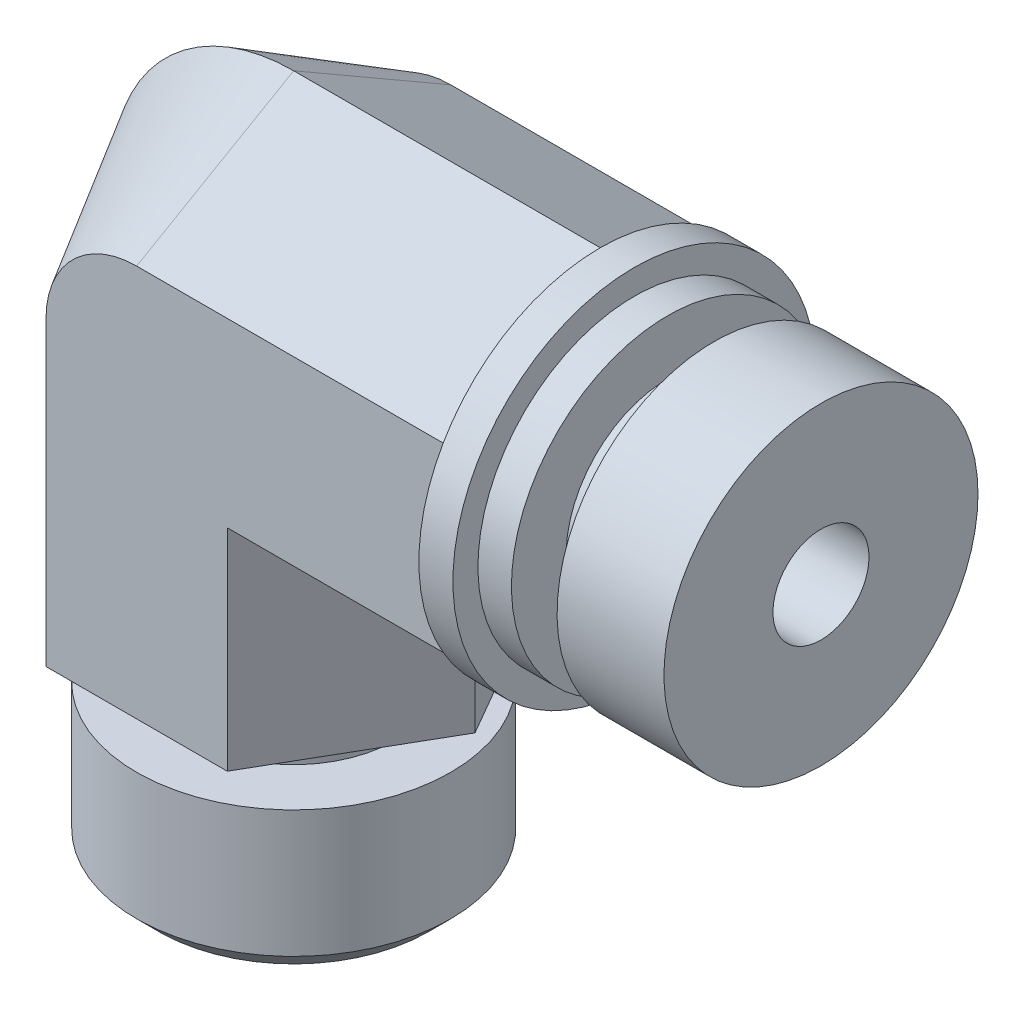
ISO-10303-21;
HEADER;
FILE_DESCRIPTION(('STEP AP214'),'2;1');
FILE_NAME('part.step','',(''),(''),'','','');
FILE_SCHEMA(('AUTOMOTIVE_DESIGN { 1 0 10303 214 1 1 1 1 }'));
ENDSEC;
DATA;
#1=APPLICATION_CONTEXT('core data for automotive mechanical design processes');
#2=APPLICATION_PROTOCOL_DEFINITION('international standard','automotive_design',2000,#1);
#3=PRODUCT_CONTEXT('',#1,'mechanical');
#4=PRODUCT('Part','Part','',(#3));
#5=PRODUCT_RELATED_PRODUCT_CATEGORY('part','',(#4));
#6=PRODUCT_DEFINITION_FORMATION('','',#4);
#7=PRODUCT_DEFINITION_CONTEXT('part definition',#1,'design');
#8=PRODUCT_DEFINITION('design','',#6,#7);
#9=PRODUCT_DEFINITION_SHAPE('','',#8);
#10=(LENGTH_UNIT() NAMED_UNIT(*) SI_UNIT(.MILLI.,.METRE.));
#11=(NAMED_UNIT(*) PLANE_ANGLE_UNIT() SI_UNIT($,.RADIAN.));
#12=(NAMED_UNIT(*) SI_UNIT($,.STERADIAN.) SOLID_ANGLE_UNIT());
#13=UNCERTAINTY_MEASURE_WITH_UNIT(LENGTH_MEASURE(1.E-05),#10,'distance_accuracy_value','');
#14=(GEOMETRIC_REPRESENTATION_CONTEXT(3) GLOBAL_UNCERTAINTY_ASSIGNED_CONTEXT((#13)) GLOBAL_UNIT_ASSIGNED_CONTEXT((#10,
#11,#12)) REPRESENTATION_CONTEXT('',''));
#15=CARTESIAN_POINT('',(0.,0.,0.));
#16=DIRECTION('',(0.,0.,1.));
#17=DIRECTION('',(1.,0.,0.));
#18=AXIS2_PLACEMENT_3D('',#15,#16,#17);
#19=CARTESIAN_POINT('',(46.99,22.606,0.));
#20=DIRECTION('',(-1.,0.,0.));
#21=DIRECTION('',(0.,-1.,0.));
#22=AXIS2_PLACEMENT_3D('',#19,#20,#21);
#23=CYLINDRICAL_SURFACE('',#22,2.1844);
#24=CARTESIAN_POINT('',(2.1844,22.606,0.));
#25=DIRECTION('',(-1.,0.,0.));
#26=DIRECTION('',(0.,1.,0.));
#27=AXIS2_PLACEMENT_3D('',#24,#25,#26);
#28=CIRCLE('',#27,2.1844);
#29=CARTESIAN_POINT('',(2.1844,24.7904,0.));
#30=VERTEX_POINT('',#29);
#31=CARTESIAN_POINT('',(2.1844,20.4216,0.));
#32=VERTEX_POINT('',#31);
#33=EDGE_CURVE('E256',#30,#32,#28,.T.);
#34=ORIENTED_EDGE('',*,*,#33,.T.);
#35=CARTESIAN_POINT('',(2.1844,22.606,0.));
#36=DIRECTION('',(-1.,0.,0.));
#37=DIRECTION('',(0.,-1.,0.));
#38=AXIS2_PLACEMENT_3D('',#35,#36,#37);
#39=CIRCLE('',#38,2.1844);
#40=EDGE_CURVE('E207',#32,#30,#39,.T.);
#41=ORIENTED_EDGE('',*,*,#40,.T.);
#42=EDGE_LOOP('',(#34,#41));
#43=FACE_BOUND('',#42,.T.);
#44=CARTESIAN_POINT('',(23.99,22.606,0.));
#45=DIRECTION('',(1.,0.,0.));
#46=DIRECTION('',(0.,0.,-1.));
#47=AXIS2_PLACEMENT_3D('',#44,#45,#46);
#48=CIRCLE('',#47,2.1844);
#49=CARTESIAN_POINT('',(23.99,22.606,-2.1844));
#50=VERTEX_POINT('',#49);
#51=EDGE_CURVE('E210',#50,#50,#48,.F.);
#52=ORIENTED_EDGE('',*,*,#51,.F.);
#53=EDGE_LOOP('',(#52));
#54=FACE_BOUND('',#53,.T.);
#55=ADVANCED_FACE('F48',(#43,#54),#23,.F.);
#56=CARTESIAN_POINT('',(12.29233,22.606,0.));
#57=DIRECTION('',(1.,0.,0.));
#58=DIRECTION('',(0.,-1.,0.));
#59=AXIS2_PLACEMENT_3D('',#56,#57,#58);
#60=CYLINDRICAL_SURFACE('',#59,7.14375);
#61=CARTESIAN_POINT('',(19.1262,22.606,0.));
#62=DIRECTION('',(1.,0.,0.));
#63=DIRECTION('',(0.,1.,0.));
#64=AXIS2_PLACEMENT_3D('',#61,#62,#63);
#65=CIRCLE('',#64,7.14375);
#66=CARTESIAN_POINT('',(19.1262,15.46225,0.));
#67=VERTEX_POINT('',#66);
#68=EDGE_CURVE('E52',#67,#67,#65,.T.);
#69=ORIENTED_EDGE('',*,*,#68,.T.);
#70=EDGE_LOOP('',(#69));
#71=FACE_BOUND('',#70,.T.);
#72=CARTESIAN_POINT('',(23.99,22.606,0.));
#73=DIRECTION('',(1.,0.,0.));
#74=DIRECTION('',(0.,0.,-1.));
#75=AXIS2_PLACEMENT_3D('',#72,#73,#74);
#76=CIRCLE('',#75,7.14375);
#77=CARTESIAN_POINT('',(23.99,22.606,-7.14375));
#78=VERTEX_POINT('',#77);
#79=EDGE_CURVE('E957',#78,#78,#76,.T.);
#80=ORIENTED_EDGE('',*,*,#79,.F.);
#81=EDGE_LOOP('',(#80));
#82=FACE_BOUND('',#81,.T.);
#83=ADVANCED_FACE('F471',(#71,#82),#60,.T.);
#84=CARTESIAN_POINT('',(0.,9.3345,0.));
#85=DIRECTION('',(0.,-1.,0.));
#86=DIRECTION('',(1.,0.,0.));
#87=AXIS2_PLACEMENT_3D('',#84,#85,#86);
#88=CYLINDRICAL_SURFACE('',#87,4.6228);
#89=CARTESIAN_POINT('',(0.,6.7818,0.));
#90=DIRECTION('',(0.,1.,0.));
#91=DIRECTION('',(-1.,0.,0.));
#92=AXIS2_PLACEMENT_3D('',#89,#90,#91);
#93=CIRCLE('',#92,4.6228);
#94=CARTESIAN_POINT('',(4.6228,6.7818,0.));
#95=VERTEX_POINT('',#94);
#96=EDGE_CURVE('E196',#95,#95,#93,.T.);
#97=ORIENTED_EDGE('',*,*,#96,.T.);
#98=EDGE_LOOP('',(#97));
#99=FACE_BOUND('',#98,.T.);
#100=CARTESIAN_POINT('',(0.,8.89,0.));
#101=DIRECTION('',(0.,-1.,0.));
#102=DIRECTION('',(-1.,0.,0.));
#103=AXIS2_PLACEMENT_3D('',#100,#101,#102);
#104=CIRCLE('',#103,4.6228);
#105=CARTESIAN_POINT('',(4.6228,8.89,0.));
#106=VERTEX_POINT('',#105);
#107=EDGE_CURVE('E201',#106,#106,#104,.T.);
#108=ORIENTED_EDGE('',*,*,#107,.T.);
#109=EDGE_LOOP('',(#108));
#110=FACE_BOUND('',#109,.T.);
#111=ADVANCED_FACE('F197',(#99,#110),#88,.T.);
#112=CARTESIAN_POINT('',(0.,6.7818,0.));
#113=DIRECTION('',(0.,-1.,0.));
#114=DIRECTION('',(1.,0.,0.));
#115=AXIS2_PLACEMENT_3D('',#112,#113,#114);
#116=PLANE('',#115);
#117=ORIENTED_EDGE('',*,*,#96,.F.);
#118=EDGE_LOOP('',(#117));
#119=FACE_BOUND('',#118,.T.);
#120=CARTESIAN_POINT('',(0.,6.7818,0.));
#121=DIRECTION('',(0.,-1.,0.));
#122=DIRECTION('',(-1.,0.,0.));
#123=AXIS2_PLACEMENT_3D('',#120,#121,#122);
#124=CIRCLE('',#123,7.14375);
#125=CARTESIAN_POINT('',(7.14375,6.7818,0.));
#126=VERTEX_POINT('',#125);
#127=EDGE_CURVE('E205',#126,#126,#124,.T.);
#128=ORIENTED_EDGE('',*,*,#127,.F.);
#129=EDGE_LOOP('',(#128));
#130=FACE_BOUND('',#129,.T.);
#131=ADVANCED_FACE('F569',(#119,#130),#116,.F.);
#132=CARTESIAN_POINT('',(0.,9.3345,0.));
#133=DIRECTION('',(0.,-1.,0.));
#134=DIRECTION('',(1.,0.,0.));
#135=AXIS2_PLACEMENT_3D('',#132,#133,#134);
#136=CYLINDRICAL_SURFACE('',#135,7.14375);
#137=ORIENTED_EDGE('',*,*,#127,.T.);
#138=EDGE_LOOP('',(#137));
#139=FACE_BOUND('',#138,.T.);
#140=CARTESIAN_POINT('',(0.,1.00965,0.));
#141=DIRECTION('',(0.,-1.,0.));
#142=DIRECTION('',(-1.,0.,0.));
#143=AXIS2_PLACEMENT_3D('',#140,#141,#142);
#144=CIRCLE('',#143,7.14375);
#145=CARTESIAN_POINT('',(7.14375,1.00965,0.));
#146=VERTEX_POINT('',#145);
#147=EDGE_CURVE('E215',#146,#146,#144,.T.);
#148=ORIENTED_EDGE('',*,*,#147,.F.);
#149=EDGE_LOOP('',(#148));
#150=FACE_BOUND('',#149,.T.);
#151=ADVANCED_FACE('F588',(#139,#150),#136,.T.);
#152=CARTESIAN_POINT('',(0.,19.2659,0.));
#153=DIRECTION('',(0.,1.,0.));
#154=DIRECTION('',(-1.,0.,0.));
#155=AXIS2_PLACEMENT_3D('',#152,#153,#154);
#156=CONICAL_SURFACE('',#155,25.4,0.7853981625);
#157=CARTESIAN_POINT('',(0.,0.,0.));
#158=DIRECTION('',(0.,1.,0.));
#159=DIRECTION('',(-1.,0.,0.));
#160=AXIS2_PLACEMENT_3D('',#157,#158,#159);
#161=CIRCLE('',#160,6.1341);
#162=CARTESIAN_POINT('',(6.1341,0.,0.));
#163=VERTEX_POINT('',#162);
#164=EDGE_CURVE('E214',#163,#163,#161,.T.);
#165=ORIENTED_EDGE('',*,*,#164,.T.);
#166=EDGE_LOOP('',(#165));
#167=FACE_BOUND('',#166,.T.);
#168=ORIENTED_EDGE('',*,*,#147,.T.);
#169=EDGE_LOOP('',(#168));
#170=FACE_BOUND('',#169,.T.);
#171=ADVANCED_FACE('F591',(#167,#170),#156,.T.);
#172=CARTESIAN_POINT('',(0.,0.,0.));
#173=DIRECTION('',(0.,-1.,0.));
#174=DIRECTION('',(1.,0.,0.));
#175=AXIS2_PLACEMENT_3D('',#172,#173,#174);
#176=PLANE('',#175);
#177=CARTESIAN_POINT('',(0.,0.,0.));
#178=DIRECTION('',(0.,1.,0.));
#179=DIRECTION('',(-1.,0.,0.));
#180=AXIS2_PLACEMENT_3D('',#177,#178,#179);
#181=CIRCLE('',#180,5.4991);
#182=CARTESIAN_POINT('',(-5.4991,0.,0.));
#183=VERTEX_POINT('',#182);
#184=EDGE_CURVE('E218',#183,#183,#181,.T.);
#185=ORIENTED_EDGE('',*,*,#184,.T.);
#186=EDGE_LOOP('',(#185));
#187=FACE_BOUND('',#186,.T.);
#188=ORIENTED_EDGE('',*,*,#164,.F.);
#189=EDGE_LOOP('',(#188));
#190=FACE_BOUND('',#189,.T.);
#191=ADVANCED_FACE('F595',(#187,#190),#176,.T.);
#192=CARTESIAN_POINT('',(0.,0.4572,0.));
#193=DIRECTION('',(0.,1.,0.));
#194=DIRECTION('',(-1.,0.,0.));
#195=AXIS2_PLACEMENT_3D('',#192,#193,#194);
#196=TOROIDAL_SURFACE('',#195,4.699,0.889);
#197=CARTESIAN_POINT('',(0.,0.84470611608096,0.));
#198=DIRECTION('',(0.,-1.,0.));
#199=DIRECTION('',(1.,0.,0.));
#200=AXIS2_PLACEMENT_3D('',#197,#198,#199);
#201=CIRCLE('',#200,5.4991);
#202=CARTESIAN_POINT('',(0.,0.84470611608096,-5.4991));
#203=VERTEX_POINT('',#202);
#204=EDGE_CURVE('E219',#203,#203,#201,.T.);
#205=ORIENTED_EDGE('',*,*,#204,.F.);
#206=EDGE_LOOP('',(#205));
#207=FACE_BOUND('',#206,.T.);
#208=CARTESIAN_POINT('',(0.,0.0696938839190402,0.));
#209=DIRECTION('',(0.,-1.,0.));
#210=DIRECTION('',(1.,0.,0.));
#211=AXIS2_PLACEMENT_3D('',#208,#209,#210);
#212=CIRCLE('',#211,5.4991);
#213=CARTESIAN_POINT('',(0.,0.0696938839190402,-5.4991));
#214=VERTEX_POINT('',#213);
#215=EDGE_CURVE('E226',#214,#214,#212,.T.);
#216=ORIENTED_EDGE('',*,*,#215,.T.);
#217=EDGE_LOOP('',(#216));
#218=FACE_BOUND('',#217,.T.);
#219=ADVANCED_FACE('F599',(#207,#218),#196,.T.);
#220=CARTESIAN_POINT('',(0.,9.3345,0.));
#221=DIRECTION('',(0.,-1.,0.));
#222=DIRECTION('',(1.,0.,0.));
#223=AXIS2_PLACEMENT_3D('',#220,#221,#222);
#224=CYLINDRICAL_SURFACE('',#223,5.4991);
#225=CARTESIAN_POINT('',(0.,1.3462,0.));
#226=DIRECTION('',(0.,1.,0.));
#227=DIRECTION('',(-1.,0.,0.));
#228=AXIS2_PLACEMENT_3D('',#225,#226,#227);
#229=CIRCLE('',#228,5.4991);
#230=CARTESIAN_POINT('',(5.4991,1.3462,0.));
#231=VERTEX_POINT('',#230);
#232=EDGE_CURVE('E223',#231,#231,#229,.T.);
#233=ORIENTED_EDGE('',*,*,#232,.T.);
#234=EDGE_LOOP('',(#233));
#235=FACE_BOUND('',#234,.T.);
#236=ORIENTED_EDGE('',*,*,#204,.T.);
#237=EDGE_LOOP('',(#236));
#238=FACE_BOUND('',#237,.T.);
#239=ADVANCED_FACE('F563',(#235,#238),#224,.F.);
#240=CARTESIAN_POINT('',(0.,9.3345,0.));
#241=DIRECTION('',(0.,-1.,0.));
#242=DIRECTION('',(1.,0.,0.));
#243=AXIS2_PLACEMENT_3D('',#240,#241,#242);
#244=CYLINDRICAL_SURFACE('',#243,5.4991);
#245=ORIENTED_EDGE('',*,*,#184,.F.);
#246=EDGE_LOOP('',(#245));
#247=FACE_BOUND('',#246,.T.);
#248=ORIENTED_EDGE('',*,*,#215,.F.);
#249=EDGE_LOOP('',(#248));
#250=FACE_BOUND('',#249,.T.);
#251=ADVANCED_FACE('F604',(#247,#250),#244,.F.);
#252=CARTESIAN_POINT('',(0.,1.3462,0.));
#253=DIRECTION('',(0.,-1.,0.));
#254=DIRECTION('',(1.,0.,0.));
#255=AXIS2_PLACEMENT_3D('',#252,#253,#254);
#256=PLANE('',#255);
#257=CARTESIAN_POINT('',(0.,1.3462,0.));
#258=DIRECTION('',(0.,-1.,0.));
#259=DIRECTION('',(-1.,0.,0.));
#260=AXIS2_PLACEMENT_3D('',#257,#258,#259);
#261=CIRCLE('',#260,3.4544);
#262=CARTESIAN_POINT('',(3.4544,1.3462,0.));
#263=VERTEX_POINT('',#262);
#264=EDGE_CURVE('E227',#263,#263,#261,.T.);
#265=ORIENTED_EDGE('',*,*,#264,.F.);
#266=EDGE_LOOP('',(#265));
#267=FACE_BOUND('',#266,.T.);
#268=ORIENTED_EDGE('',*,*,#232,.F.);
#269=EDGE_LOOP('',(#268));
#270=FACE_BOUND('',#269,.T.);
#271=ADVANCED_FACE('F607',(#267,#270),#256,.T.);
#272=CARTESIAN_POINT('',(0.,9.3345,0.));
#273=DIRECTION('',(0.,-1.,0.));
#274=DIRECTION('',(1.,0.,0.));
#275=AXIS2_PLACEMENT_3D('',#272,#273,#274);
#276=CYLINDRICAL_SURFACE('',#275,3.4544);
#277=CARTESIAN_POINT('',(0.,0.127,0.));
#278=DIRECTION('',(0.,1.,0.));
#279=DIRECTION('',(-1.,0.,0.));
#280=AXIS2_PLACEMENT_3D('',#277,#278,#279);
#281=CIRCLE('',#280,3.4544);
#282=CARTESIAN_POINT('',(3.4544,0.127,0.));
#283=VERTEX_POINT('',#282);
#284=EDGE_CURVE('E222',#283,#283,#281,.T.);
#285=ORIENTED_EDGE('',*,*,#284,.T.);
#286=EDGE_LOOP('',(#285));
#287=FACE_BOUND('',#286,.T.);
#288=ORIENTED_EDGE('',*,*,#264,.T.);
#289=EDGE_LOOP('',(#288));
#290=FACE_BOUND('',#289,.T.);
#291=ADVANCED_FACE('F611',(#287,#290),#276,.T.);
#292=CARTESIAN_POINT('',(0.,0.127,0.));
#293=DIRECTION('',(0.,-1.,0.));
#294=DIRECTION('',(1.,0.,0.));
#295=AXIS2_PLACEMENT_3D('',#292,#293,#294);
#296=PLANE('',#295);
#297=CARTESIAN_POINT('',(0.,0.127,0.));
#298=DIRECTION('',(0.,-1.,0.));
#299=DIRECTION('',(-1.,0.,0.));
#300=AXIS2_PLACEMENT_3D('',#297,#298,#299);
#301=CIRCLE('',#300,3.1496);
#302=CARTESIAN_POINT('',(3.1496,0.127,0.));
#303=VERTEX_POINT('',#302);
#304=EDGE_CURVE('E233',#303,#303,#301,.T.);
#305=ORIENTED_EDGE('',*,*,#304,.F.);
#306=EDGE_LOOP('',(#305));
#307=FACE_BOUND('',#306,.T.);
#308=ORIENTED_EDGE('',*,*,#284,.F.);
#309=EDGE_LOOP('',(#308));
#310=FACE_BOUND('',#309,.T.);
#311=ADVANCED_FACE('F615',(#307,#310),#296,.T.);
#312=CARTESIAN_POINT('',(0.,9.3345,0.));
#313=DIRECTION('',(0.,-1.,0.));
#314=DIRECTION('',(1.,0.,0.));
#315=AXIS2_PLACEMENT_3D('',#312,#313,#314);
#316=CYLINDRICAL_SURFACE('',#315,3.1496);
#317=CARTESIAN_POINT('',(0.,0.,0.));
#318=DIRECTION('',(0.,1.,0.));
#319=DIRECTION('',(-1.,0.,0.));
#320=AXIS2_PLACEMENT_3D('',#317,#318,#319);
#321=CIRCLE('',#320,3.1496);
#322=CARTESIAN_POINT('',(3.1496,0.,0.));
#323=VERTEX_POINT('',#322);
#324=EDGE_CURVE('E230',#323,#323,#321,.T.);
#325=ORIENTED_EDGE('',*,*,#324,.T.);
#326=EDGE_LOOP('',(#325));
#327=FACE_BOUND('',#326,.T.);
#328=ORIENTED_EDGE('',*,*,#304,.T.);
#329=EDGE_LOOP('',(#328));
#330=FACE_BOUND('',#329,.T.);
#331=ADVANCED_FACE('F619',(#327,#330),#316,.T.);
#332=CARTESIAN_POINT('',(0.,0.,0.));
#333=DIRECTION('',(0.,-1.,0.));
#334=DIRECTION('',(1.,0.,0.));
#335=AXIS2_PLACEMENT_3D('',#332,#333,#334);
#336=PLANE('',#335);
#337=CARTESIAN_POINT('',(0.,0.,0.));
#338=DIRECTION('',(0.,-1.,0.));
#339=DIRECTION('',(1.,0.,0.));
#340=AXIS2_PLACEMENT_3D('',#337,#338,#339);
#341=CIRCLE('',#340,2.1844);
#342=CARTESIAN_POINT('',(-2.1844,0.,0.));
#343=VERTEX_POINT('',#342);
#344=EDGE_CURVE('E241',#343,#343,#341,.T.);
#345=ORIENTED_EDGE('',*,*,#344,.F.);
#346=EDGE_LOOP('',(#345));
#347=FACE_BOUND('',#346,.T.);
#348=ORIENTED_EDGE('',*,*,#324,.F.);
#349=EDGE_LOOP('',(#348));
#350=FACE_BOUND('',#349,.T.);
#351=ADVANCED_FACE('F502',(#347,#350),#336,.T.);
#352=CARTESIAN_POINT('',(2.1844000012887,24.7903999999999,-2.397182658E-08));
#353=CARTESIAN_POINT('',(2.18440000128864,24.7904000137665,1.25445399300066));
#354=CARTESIAN_POINT('',(2.18440000103053,23.9154177992682,2.1443282895415));
#355=CARTESIAN_POINT('',(2.18440000066446,22.6746136621303,2.18332213046283));
#356=CARTESIAN_POINT('',(2.18440000027775,21.3635640246973,2.22452352516503));
#357=CARTESIAN_POINT('',(2.1844,20.4216,1.31169688066195));
#358=CARTESIAN_POINT('',(2.1844,20.4216,0.));
#359=CARTESIAN_POINT('',(-0.374783812697195,24.7904000007548,-2.397189516E-08));
#360=CARTESIAN_POINT('',(-0.374783820761416,24.7904000145213,1.25445399300066));
#361=CARTESIAN_POINT('',(0.137768898461754,23.9154177998717,2.1443282895415));
#362=CARTESIAN_POINT('',(0.864615140562655,22.6746136625196,2.18332213046283));
#363=CARTESIAN_POINT('',(1.63261024442685,21.3635640248601,2.22452352516504));
#364=CARTESIAN_POINT('',(2.1844,20.4216,1.31169688066195));
#365=CARTESIAN_POINT('',(2.1844,20.4216,0.));
#366=CARTESIAN_POINT('',(-2.18440002816449,22.9807837612032,-2.397189516E-08));
#367=CARTESIAN_POINT('',(-2.18440004193098,22.9807837692674,1.25445399300066));
#368=CARTESIAN_POINT('',(-1.30941782179178,22.4682310603574,2.1443282895415));
#369=CARTESIAN_POINT('',(-0.0686136766548716,21.7413848328816,2.18332213046283));
#370=CARTESIAN_POINT('',(1.24243596923008,20.9733897444707,2.22452352516503));
#371=CARTESIAN_POINT('',(2.1844,20.4216,1.31169688066195));
#372=CARTESIAN_POINT('',(2.1844,20.4216,0.));
#373=CARTESIAN_POINT('',(-2.18439999999995,20.4215999519201,-2.397182658E-08));
#374=CARTESIAN_POINT('',(-2.18440001376652,20.4215999519202,1.25445399300066));
#375=CARTESIAN_POINT('',(-1.30941779926823,20.4215999615496,2.1443282895415));
#376=CARTESIAN_POINT('',(-0.0686136621302627,20.4215999752051,2.18332213046283));
#377=CARTESIAN_POINT('',(1.24243597530266,20.4215999896335,2.22452352516503));
#378=CARTESIAN_POINT('',(2.1844,20.4216,1.31169688066195));
#379=CARTESIAN_POINT('',(2.1844,20.4216,0.));
#380=(BOUNDED_SURFACE() B_SPLINE_SURFACE(3,3,((#352,#353,#354,#355,#356,#357,#358),(#359,#360,
#361,#362,#363,#364,#365),(#366,#367,#368,#369,#370,#371,#372),(#373,#374,#375,#376,#377,#378,
#379)),.UNSPECIFIED.,.F.,.F.,.F.) B_SPLINE_SURFACE_WITH_KNOTS((4,4),(4,3,4),(0.021404466683785,
0.978595540565347),(0.043186768001074,1.,2.),
.UNSPECIFIED.) GEOMETRIC_REPRESENTATION_ITEM() RATIONAL_B_SPLINE_SURFACE(((1.34692106131306,
1.10207195925985,1.11364588118783,1.38164282709699,1.10154955816374,1.10154955816374,
1.38164282709699),(1.08391836237725,0.886879021802292,0.896192994879713,1.11186028160951,
0.886458625866062,0.886458625866062,1.11186028160951),(1.08391836436906,0.886879023432021,
0.896192996526557,1.11186028365267,0.886458627495019,0.886458627495019,1.11186028365267),
(1.34692106728849,1.10207196414904,1.11364588612836,1.38164283322645,1.10154956305061,
1.10154956305061,1.38164283322645))) REPRESENTATION_ITEM('') SURFACE());
#381=CARTESIAN_POINT('',(0.,20.4216,0.));
#382=DIRECTION('',(0.,-1.,0.));
#383=DIRECTION('',(1.,0.,0.));
#384=AXIS2_PLACEMENT_3D('',#381,#382,#383);
#385=CIRCLE('',#384,2.1844);
#386=CARTESIAN_POINT('',(-2.1844,20.4216,0.));
#387=VERTEX_POINT('',#386);
#388=EDGE_CURVE('E236',#32,#387,#385,.T.);
#389=CARTESIAN_POINT('',(2.18439999999967,20.4216000000004,0.));
#390=DIRECTION('',(0.,0.,1.));
#391=DIRECTION('',(-1.,0.,0.));
#392=AXIS2_PLACEMENT_3D('',#389,#390,#391);
#393=CIRCLE('',#392,4.36879999999962);
#394=EDGE_CURVE('E244',#30,#387,#393,.T.);
#395=ORIENTED_EDGE('',*,*,#40,.F.);
#396=ORIENTED_EDGE('',*,*,#388,.T.);
#397=ORIENTED_EDGE('',*,*,#394,.F.);
#398=EDGE_LOOP('',(#395,#396,#397));
#399=FACE_BOUND('',#398,.T.);
#400=ADVANCED_FACE('F496',(#399),#380,.F.);
#401=CARTESIAN_POINT('',(0.,20.4216,0.));
#402=DIRECTION('',(0.,-1.,0.));
#403=DIRECTION('',(1.,0.,0.));
#404=AXIS2_PLACEMENT_3D('',#401,#402,#403);
#405=CYLINDRICAL_SURFACE('',#404,2.1844);
#406=ORIENTED_EDGE('',*,*,#388,.F.);
#407=CARTESIAN_POINT('',(0.,20.4216,0.));
#408=DIRECTION('',(0.,-1.,0.));
#409=DIRECTION('',(-1.,0.,0.));
#410=AXIS2_PLACEMENT_3D('',#407,#408,#409);
#411=CIRCLE('',#410,2.1844);
#412=EDGE_CURVE('E245',#387,#32,#411,.T.);
#413=ORIENTED_EDGE('',*,*,#412,.F.);
#414=EDGE_LOOP('',(#406,#413));
#415=FACE_BOUND('',#414,.T.);
#416=ORIENTED_EDGE('',*,*,#344,.T.);
#417=EDGE_LOOP('',(#416));
#418=FACE_BOUND('',#417,.T.);
#419=ADVANCED_FACE('F501',(#415,#418),#405,.F.);
#420=CARTESIAN_POINT('',(2.1844,20.4216,0.));
#421=CARTESIAN_POINT('',(2.1844,20.4216,-1.31169688066195));
#422=CARTESIAN_POINT('',(2.18440001035531,21.3635640246973,-2.22452352516504));
#423=CARTESIAN_POINT('',(2.18440002476818,22.6746136621303,-2.18332213046283));
#424=CARTESIAN_POINT('',(2.18440003840892,23.9154177992553,-2.14432828954191));
#425=CARTESIAN_POINT('',(2.18440004802797,24.7904000137517,-1.25445399301577));
#426=CARTESIAN_POINT('',(2.18440004802802,24.7904,2.394594144E-08));
#427=CARTESIAN_POINT('',(2.1844,20.4216,0.));
#428=CARTESIAN_POINT('',(2.1844,20.4216,-1.31169688066195));
#429=CARTESIAN_POINT('',(1.63261025565688,21.3635640307634,-2.22452352516503));
#430=CARTESIAN_POINT('',(0.864615167422925,22.6746136766392,-2.18332213046283));
#431=CARTESIAN_POINT('',(0.137768940122376,23.9154178217545,-2.14432828954191));
#432=CARTESIAN_POINT('',(-0.374783768668225,24.7904000418857,-1.25445399301578));
#433=CARTESIAN_POINT('',(-0.374783760612717,24.7904000281341,2.394601002E-08));
#434=CARTESIAN_POINT('',(2.1844,20.4216,0.));
#435=CARTESIAN_POINT('',(2.1844,20.4216,-1.31169688066195));
#436=CARTESIAN_POINT('',(1.24243597529227,20.97338975572,-2.22452352516503));
#437=CARTESIAN_POINT('',(-0.0686136621551292,21.741384859788,-2.18332213046283));
#438=CARTESIAN_POINT('',(-1.30941779929366,22.4682311020744,-2.14432828954191));
#439=CARTESIAN_POINT('',(-2.1844000137998,22.9807838214327,-1.25445399301577));
#440=CARTESIAN_POINT('',(-2.18440000004816,22.9807838133772,2.394601002E-08));
#441=CARTESIAN_POINT('',(2.1844,20.4216,0.));
#442=CARTESIAN_POINT('',(2.1844,20.4216,-1.31169688066195));
#443=CARTESIAN_POINT('',(1.24243597530266,20.4215999999824,-2.22452352516503));
#444=CARTESIAN_POINT('',(-0.0686136621302626,20.4215999999577,-2.18332213046283));
#445=CARTESIAN_POINT('',(-1.30941779925528,20.4215999999342,-2.1443282895419));
#446=CARTESIAN_POINT('',(-2.18440001375166,20.4215999999177,-1.25445399301578));
#447=CARTESIAN_POINT('',(-2.18439999999995,20.4215999999176,2.394594144E-08));
#448=(BOUNDED_SURFACE() B_SPLINE_SURFACE(3,3,((#420,#421,#422,#423,#424,#425,#426),(#427,#428,
#429,#430,#431,#432,#433),(#434,#435,#436,#437,#438,#439,#440),(#441,#442,#443,#444,#445,#446,
#447)),.UNSPECIFIED.,.F.,.F.,.F.) B_SPLINE_SURFACE_WITH_KNOTS((4,4),(4,3,4),(0.021404459442696,
0.978595533129325),(0.,1.,1.95681323199088),
.UNSPECIFIED.) GEOMETRIC_REPRESENTATION_ITEM() RATIONAL_B_SPLINE_SURFACE(((1.38164283321965,
1.10154956304519,1.10154956304519,1.38164283321965,1.11364588612513,1.10207196414381,
1.34692106727568),(1.11186028370534,0.886458627537015,0.886458627537015,1.11186028370534,
0.896192996570828,0.886879023474194,1.08391836441544),(1.11186028161178,0.88645862586787,
0.88645862586787,1.11186028161178,0.896192994883353,0.886879021804257,1.08391836237449),
(1.38164282693897,1.10154955803775,1.10154955803775,1.38164282693897,1.11364588106271,
1.102071959134,1.34692106115284))) REPRESENTATION_ITEM('') SURFACE());
#449=ORIENTED_EDGE('',*,*,#33,.F.);
#450=ORIENTED_EDGE('',*,*,#394,.T.);
#451=ORIENTED_EDGE('',*,*,#412,.T.);
#452=EDGE_LOOP('',(#449,#450,#451));
#453=FACE_BOUND('',#452,.T.);
#454=ADVANCED_FACE('F482',(#453),#448,.F.);
#455=CARTESIAN_POINT('',(19.1262,22.606,0.));
#456=DIRECTION('',(1.,0.,0.));
#457=DIRECTION('',(0.,0.,1.));
#458=AXIS2_PLACEMENT_3D('',#455,#456,#457);
#459=PLANE('',#458);
#460=CARTESIAN_POINT('',(19.1262,22.606,0.));
#461=DIRECTION('',(-1.,0.,0.));
#462=DIRECTION('',(0.,1.,0.));
#463=AXIS2_PLACEMENT_3D('',#460,#461,#462);
#464=CIRCLE('',#463,4.6228);
#465=CARTESIAN_POINT('',(19.1262,17.9832,0.));
#466=VERTEX_POINT('',#465);
#467=EDGE_CURVE('E257',#466,#466,#464,.T.);
#468=ORIENTED_EDGE('',*,*,#467,.F.);
#469=EDGE_LOOP('',(#468));
#470=FACE_BOUND('',#469,.T.);
#471=ORIENTED_EDGE('',*,*,#68,.F.);
#472=EDGE_LOOP('',(#471));
#473=FACE_BOUND('',#472,.T.);
#474=ADVANCED_FACE('F487',(#470,#473),#459,.F.);
#475=CARTESIAN_POINT('',(12.29233,22.606,0.));
#476=DIRECTION('',(1.,0.,0.));
#477=DIRECTION('',(0.,-1.,0.));
#478=AXIS2_PLACEMENT_3D('',#475,#476,#477);
#479=CYLINDRICAL_SURFACE('',#478,4.6228);
#480=CARTESIAN_POINT('',(17.018,22.606,0.));
#481=DIRECTION('',(1.,0.,0.));
#482=DIRECTION('',(0.,1.,0.));
#483=AXIS2_PLACEMENT_3D('',#480,#481,#482);
#484=CIRCLE('',#483,4.6228);
#485=CARTESIAN_POINT('',(17.018,17.9832,0.));
#486=VERTEX_POINT('',#485);
#487=EDGE_CURVE('E249',#486,#486,#484,.T.);
#488=ORIENTED_EDGE('',*,*,#487,.T.);
#489=EDGE_LOOP('',(#488));
#490=FACE_BOUND('',#489,.T.);
#491=ORIENTED_EDGE('',*,*,#467,.T.);
#492=EDGE_LOOP('',(#491));
#493=FACE_BOUND('',#492,.T.);
#494=ADVANCED_FACE('F490',(#490,#493),#479,.T.);
#495=CARTESIAN_POINT('',(17.018,22.606,0.));
#496=DIRECTION('',(1.,0.,0.));
#497=DIRECTION('',(0.,0.,1.));
#498=AXIS2_PLACEMENT_3D('',#495,#496,#497);
#499=PLANE('',#498);
#500=ORIENTED_EDGE('',*,*,#487,.F.);
#501=EDGE_LOOP('',(#500));
#502=FACE_BOUND('',#501,.T.);
#503=CARTESIAN_POINT('',(17.018,22.606,0.));
#504=DIRECTION('',(-1.,0.,0.));
#505=DIRECTION('',(0.,1.,0.));
#506=AXIS2_PLACEMENT_3D('',#503,#504,#505);
#507=CIRCLE('',#506,7.112);
#508=CARTESIAN_POINT('',(17.018,15.494,0.));
#509=VERTEX_POINT('',#508);
#510=EDGE_CURVE('E261',#509,#509,#507,.T.);
#511=ORIENTED_EDGE('',*,*,#510,.F.);
#512=EDGE_LOOP('',(#511));
#513=FACE_BOUND('',#512,.T.);
#514=ADVANCED_FACE('F494',(#502,#513),#499,.T.);
#515=CARTESIAN_POINT('',(12.29233,22.606,0.));
#516=DIRECTION('',(1.,0.,0.));
#517=DIRECTION('',(0.,-1.,0.));
#518=AXIS2_PLACEMENT_3D('',#515,#516,#517);
#519=CYLINDRICAL_SURFACE('',#518,7.112);
#520=CARTESIAN_POINT('',(15.494,22.606,0.));
#521=DIRECTION('',(1.,0.,0.));
#522=DIRECTION('',(0.,1.,0.));
#523=AXIS2_PLACEMENT_3D('',#520,#521,#522);
#524=CIRCLE('',#523,7.112);
#525=CARTESIAN_POINT('',(15.494,15.494,0.));
#526=VERTEX_POINT('',#525);
#527=EDGE_CURVE('E260',#526,#526,#524,.T.);
#528=ORIENTED_EDGE('',*,*,#527,.T.);
#529=EDGE_LOOP('',(#528));
#530=FACE_BOUND('',#529,.T.);
#531=ORIENTED_EDGE('',*,*,#510,.T.);
#532=EDGE_LOOP('',(#531));
#533=FACE_BOUND('',#532,.T.);
#534=ADVANCED_FACE('F511',(#530,#533),#519,.T.);
#535=CARTESIAN_POINT('',(15.494,22.606,0.));
#536=DIRECTION('',(1.,0.,0.));
#537=DIRECTION('',(0.,0.,1.));
#538=AXIS2_PLACEMENT_3D('',#535,#536,#537);
#539=PLANE('',#538);
#540=ORIENTED_EDGE('',*,*,#527,.F.);
#541=EDGE_LOOP('',(#540));
#542=FACE_BOUND('',#541,.T.);
#543=CARTESIAN_POINT('',(15.494,22.606,0.));
#544=DIRECTION('',(-1.,0.,0.));
#545=DIRECTION('',(0.,1.,0.));
#546=AXIS2_PLACEMENT_3D('',#543,#544,#545);
#547=CIRCLE('',#546,8.24889197104768);
#548=CARTESIAN_POINT('',(15.494,14.3571080289523,0.));
#549=VERTEX_POINT('',#548);
#550=EDGE_CURVE('E264',#549,#549,#547,.T.);
#551=ORIENTED_EDGE('',*,*,#550,.F.);
#552=EDGE_LOOP('',(#551));
#553=FACE_BOUND('',#552,.T.);
#554=ADVANCED_FACE('F515',(#542,#553),#539,.T.);
#555=CARTESIAN_POINT('',(12.29233,22.606,0.));
#556=DIRECTION('',(1.,0.,0.));
#557=DIRECTION('',(0.,-1.,0.));
#558=AXIS2_PLACEMENT_3D('',#555,#556,#557);
#559=CYLINDRICAL_SURFACE('',#558,8.24889197104768);
#560=ORIENTED_EDGE('',*,*,#550,.T.);
#561=EDGE_LOOP('',(#560));
#562=FACE_BOUND('',#561,.T.);
#563=CARTESIAN_POINT('',(13.9446,22.606,0.));
#564=DIRECTION('',(-1.,0.,0.));
#565=DIRECTION('',(0.,-0.500000000000017,-0.866025403784429));
#566=AXIS2_PLACEMENT_3D('',#563,#564,#565);
#567=CIRCLE('',#566,8.24889197104768);
#568=CARTESIAN_POINT('',(13.9446,18.4815540144761,-7.14375));
#569=VERTEX_POINT('',#568);
#570=CARTESIAN_POINT('',(13.9446,14.3571080289523,0.));
#571=VERTEX_POINT('',#570);
#572=EDGE_CURVE('E344',#569,#571,#567,.T.);
#573=ORIENTED_EDGE('',*,*,#572,.F.);
#574=CARTESIAN_POINT('',(13.9446,22.606,0.));
#575=DIRECTION('',(-1.,0.,0.));
#576=DIRECTION('',(0.,0.500000000000017,-0.866025403784429));
#577=AXIS2_PLACEMENT_3D('',#574,#575,#576);
#578=CIRCLE('',#577,8.24889197104768);
#579=CARTESIAN_POINT('',(13.9446,26.7304459855238,-7.14375));
#580=VERTEX_POINT('',#579);
#581=EDGE_CURVE('E367',#580,#569,#578,.T.);
#582=ORIENTED_EDGE('',*,*,#581,.F.);
#583=CARTESIAN_POINT('',(13.9446,22.606,0.));
#584=DIRECTION('',(-1.,0.,0.));
#585=DIRECTION('',(0.,1.,0.));
#586=AXIS2_PLACEMENT_3D('',#583,#584,#585);
#587=CIRCLE('',#586,8.24889197104768);
#588=CARTESIAN_POINT('',(13.9446,30.8548919710477,0.));
#589=VERTEX_POINT('',#588);
#590=EDGE_CURVE('E336',#589,#580,#587,.T.);
#591=ORIENTED_EDGE('',*,*,#590,.F.);
#592=CARTESIAN_POINT('',(13.9446,22.606,0.));
#593=DIRECTION('',(1.,0.,0.));
#594=DIRECTION('',(0.,1.,0.));
#595=AXIS2_PLACEMENT_3D('',#592,#593,#594);
#596=CIRCLE('',#595,8.24889197104768);
#597=CARTESIAN_POINT('',(13.9446,26.7304459855238,7.14375));
#598=VERTEX_POINT('',#597);
#599=EDGE_CURVE('E269',#589,#598,#596,.T.);
#600=ORIENTED_EDGE('',*,*,#599,.T.);
#601=CARTESIAN_POINT('',(13.9446,22.606,0.));
#602=DIRECTION('',(1.,0.,0.));
#603=DIRECTION('',(0.,0.500000000000017,0.866025403784429));
#604=AXIS2_PLACEMENT_3D('',#601,#602,#603);
#605=CIRCLE('',#604,8.24889197104768);
#606=CARTESIAN_POINT('',(13.9446,18.4815540144761,7.14375));
#607=VERTEX_POINT('',#606);
#608=EDGE_CURVE('E331',#598,#607,#605,.T.);
#609=ORIENTED_EDGE('',*,*,#608,.T.);
#610=CARTESIAN_POINT('',(13.9446,22.606,0.));
#611=DIRECTION('',(1.,0.,0.));
#612=DIRECTION('',(0.,-0.500000000000017,0.866025403784429));
#613=AXIS2_PLACEMENT_3D('',#610,#611,#612);
#614=CIRCLE('',#613,8.24889197104768);
#615=EDGE_CURVE('E354',#607,#571,#614,.T.);
#616=ORIENTED_EDGE('',*,*,#615,.T.);
#617=EDGE_LOOP('',(#573,#582,#591,#600,#609,#616));
#618=FACE_BOUND('',#617,.T.);
#619=ADVANCED_FACE('F453',(#562,#618),#559,.T.);
#620=CARTESIAN_POINT('',(0.,18.4815540144761,7.14375));
#621=DIRECTION('',(0.,-0.866025403784429,0.500000000000017));
#622=DIRECTION('',(1.,0.,0.));
#623=AXIS2_PLACEMENT_3D('',#620,#621,#622);
#624=PLANE('',#623);
#625=DIRECTION('',(0.,-0.500000000000017,-0.866025403784429));
#626=VECTOR('',#625,1.);
#627=CARTESIAN_POINT('',(13.9446,18.4815540144761,7.14375));
#628=LINE('',#627,#626);
#629=EDGE_CURVE('E348',#607,#571,#628,.T.);
#630=ORIENTED_EDGE('',*,*,#629,.F.);
#631=DIRECTION('',(1.,0.,0.));
#632=VECTOR('',#631,1.);
#633=CARTESIAN_POINT('',(4.12444598552384,18.4815540144761,7.14375));
#634=LINE('',#633,#632);
#635=CARTESIAN_POINT('',(4.12444598552384,18.4815540144761,7.14375));
#636=VERTEX_POINT('',#635);
#637=EDGE_CURVE('E378',#636,#607,#634,.T.);
#638=ORIENTED_EDGE('',*,*,#637,.F.);
#639=DIRECTION('',(0.447213595499978,-0.447213595499978,-0.774596669241461));
#640=VECTOR('',#639,1.);
#641=CARTESIAN_POINT('',(4.12444598552384,18.4815540144761,7.14375));
#642=LINE('',#641,#640);
#643=CARTESIAN_POINT('',(8.24889197104768,14.3571080289523,0.));
#644=VERTEX_POINT('',#643);
#645=EDGE_CURVE('E275',#636,#644,#642,.T.);
#646=ORIENTED_EDGE('',*,*,#645,.T.);
#647=DIRECTION('',(1.,0.,0.));
#648=VECTOR('',#647,1.);
#649=CARTESIAN_POINT('',(8.24889197104768,14.3571080289523,0.));
#650=LINE('',#649,#648);
#651=EDGE_CURVE('E270',#644,#571,#650,.T.);
#652=ORIENTED_EDGE('',*,*,#651,.T.);
#653=EDGE_LOOP('',(#630,#638,#646,#652));
#654=FACE_BOUND('',#653,.T.);
#655=ADVANCED_FACE('F432',(#654),#624,.T.);
#656=CARTESIAN_POINT('',(0.,14.3571080289523,0.));
#657=DIRECTION('',(0.,-0.866025403784429,-0.500000000000017));
#658=DIRECTION('',(-1.,0.,0.));
#659=AXIS2_PLACEMENT_3D('',#656,#657,#658);
#660=PLANE('',#659);
#661=DIRECTION('',(0.,0.500000000000017,-0.866025403784429));
#662=VECTOR('',#661,1.);
#663=CARTESIAN_POINT('',(13.9446,14.3571080289523,0.));
#664=LINE('',#663,#662);
#665=EDGE_CURVE('E340',#571,#569,#664,.T.);
#666=ORIENTED_EDGE('',*,*,#665,.F.);
#667=ORIENTED_EDGE('',*,*,#651,.F.);
#668=DIRECTION('',(-0.447213595499978,0.447213595499978,-0.774596669241461));
#669=VECTOR('',#668,1.);
#670=CARTESIAN_POINT('',(8.24889197104768,14.3571080289523,0.));
#671=LINE('',#670,#669);
#672=CARTESIAN_POINT('',(4.12444598552384,18.4815540144761,-7.14375));
#673=VERTEX_POINT('',#672);
#674=EDGE_CURVE('E274',#644,#673,#671,.T.);
#675=ORIENTED_EDGE('',*,*,#674,.T.);
#676=DIRECTION('',(1.,0.,0.));
#677=VECTOR('',#676,1.);
#678=CARTESIAN_POINT('',(4.12444598552384,18.4815540144761,-7.14375));
#679=LINE('',#678,#677);
#680=EDGE_CURVE('E278',#673,#569,#679,.T.);
#681=ORIENTED_EDGE('',*,*,#680,.T.);
#682=EDGE_LOOP('',(#666,#667,#675,#681));
#683=FACE_BOUND('',#682,.T.);
#684=ADVANCED_FACE('F450',(#683),#660,.T.);
#685=CARTESIAN_POINT('',(8.24889197104768,8.89,0.));
#686=DIRECTION('',(0.866025403784429,0.,-0.500000000000017));
#687=DIRECTION('',(0.,1.,0.));
#688=AXIS2_PLACEMENT_3D('',#685,#686,#687);
#689=PLANE('',#688);
#690=DIRECTION('',(-0.500000000000017,0.,-0.866025403784429));
#691=VECTOR('',#690,1.);
#692=CARTESIAN_POINT('',(8.24889197104768,8.89,0.));
#693=LINE('',#692,#691);
#694=CARTESIAN_POINT('',(8.24889197104768,8.89,0.));
#695=VERTEX_POINT('',#694);
#696=CARTESIAN_POINT('',(4.12444598552384,8.89,-7.14375));
#697=VERTEX_POINT('',#696);
#698=EDGE_CURVE('E324',#695,#697,#693,.T.);
#699=ORIENTED_EDGE('',*,*,#698,.T.);
#700=DIRECTION('',(0.,1.,0.));
#701=VECTOR('',#700,1.);
#702=CARTESIAN_POINT('',(4.12444598552384,8.89,-7.14375));
#703=LINE('',#702,#701);
#704=EDGE_CURVE('E316',#697,#673,#703,.T.);
#705=ORIENTED_EDGE('',*,*,#704,.T.);
#706=ORIENTED_EDGE('',*,*,#674,.F.);
#707=DIRECTION('',(0.,1.,0.));
#708=VECTOR('',#707,1.);
#709=CARTESIAN_POINT('',(8.24889197104768,8.89,0.));
#710=LINE('',#709,#708);
#711=EDGE_CURVE('E11',#695,#644,#710,.T.);
#712=ORIENTED_EDGE('',*,*,#711,.F.);
#713=EDGE_LOOP('',(#699,#705,#706,#712));
#714=FACE_BOUND('',#713,.T.);
#715=ADVANCED_FACE('F426',(#714),#689,.T.);
#716=CARTESIAN_POINT('',(0.,22.606,29.7065905122483));
#717=DIRECTION('',(0.,0.,1.));
#718=DIRECTION('',(1.,0.,0.));
#719=AXIS2_PLACEMENT_3D('',#716,#717,#718);
#720=CONICAL_SURFACE('',#719,25.4,0.523598775);
#721=CARTESIAN_POINT('',(0.,22.606,-7.14375));
#722=DIRECTION('',(0.,0.,1.));
#723=DIRECTION('',(0.,1.,0.));
#724=AXIS2_PLACEMENT_3D('',#721,#722,#723);
#725=CIRCLE('',#724,4.12444598552384);
#726=CARTESIAN_POINT('',(0.,26.7304459855238,-7.14375));
#727=VERTEX_POINT('',#726);
#728=CARTESIAN_POINT('',(-4.12444598552384,22.606,-7.14375));
#729=VERTEX_POINT('',#728);
#730=EDGE_CURVE('E283',#727,#729,#725,.T.);
#731=ORIENTED_EDGE('',*,*,#730,.T.);
#732=DIRECTION('',(-0.500000000000017,0.,0.866025403784429));
#733=VECTOR('',#732,1.);
#734=CARTESIAN_POINT('',(-4.12444598552384,22.606,-7.14375));
#735=LINE('',#734,#733);
#736=CARTESIAN_POINT('',(-8.24889197104768,22.606,0.));
#737=VERTEX_POINT('',#736);
#738=EDGE_CURVE('E279',#729,#737,#735,.T.);
#739=ORIENTED_EDGE('',*,*,#738,.T.);
#740=CARTESIAN_POINT('',(0.,22.606,0.));
#741=DIRECTION('',(0.,0.,-1.));
#742=DIRECTION('',(-1.,0.,0.));
#743=AXIS2_PLACEMENT_3D('',#740,#741,#742);
#744=CIRCLE('',#743,8.24889197104768);
#745=CARTESIAN_POINT('',(0.,30.8548919710477,0.));
#746=VERTEX_POINT('',#745);
#747=EDGE_CURVE('E282',#737,#746,#744,.T.);
#748=ORIENTED_EDGE('',*,*,#747,.T.);
#749=DIRECTION('',(0.,0.500000000000017,0.866025403784429));
#750=VECTOR('',#749,1.);
#751=CARTESIAN_POINT('',(0.,26.7304459855238,-7.14375));
#752=LINE('',#751,#750);
#753=EDGE_CURVE('E304',#727,#746,#752,.T.);
#754=ORIENTED_EDGE('',*,*,#753,.F.);
#755=EDGE_LOOP('',(#731,#739,#748,#754));
#756=FACE_BOUND('',#755,.T.);
#757=ADVANCED_FACE('F529',(#756),#720,.T.);
#758=CARTESIAN_POINT('',(-4.12444598552384,8.89,-7.14375));
#759=DIRECTION('',(-0.866025403784429,0.,-0.500000000000017));
#760=DIRECTION('',(-0.500000000000017,0.,0.866025403784429));
#761=AXIS2_PLACEMENT_3D('',#758,#759,#760);
#762=PLANE('',#761);
#763=ORIENTED_EDGE('',*,*,#738,.F.);
#764=DIRECTION('',(0.,1.,0.));
#765=VECTOR('',#764,1.);
#766=CARTESIAN_POINT('',(-4.12444598552384,8.89,-7.14375));
#767=LINE('',#766,#765);
#768=CARTESIAN_POINT('',(-4.12444598552384,8.89,-7.14375));
#769=VERTEX_POINT('',#768);
#770=EDGE_CURVE('E312',#769,#729,#767,.T.);
#771=ORIENTED_EDGE('',*,*,#770,.F.);
#772=DIRECTION('',(-0.500000000000017,0.,0.866025403784429));
#773=VECTOR('',#772,1.);
#774=CARTESIAN_POINT('',(-4.12444598552384,8.89,-7.14375));
#775=LINE('',#774,#773);
#776=CARTESIAN_POINT('',(-8.24889197104768,8.89,0.));
#777=VERTEX_POINT('',#776);
#778=EDGE_CURVE('E289',#769,#777,#775,.T.);
#779=ORIENTED_EDGE('',*,*,#778,.T.);
#780=DIRECTION('',(0.,1.,0.));
#781=VECTOR('',#780,1.);
#782=CARTESIAN_POINT('',(-8.24889197104768,8.89,0.));
#783=LINE('',#782,#781);
#784=EDGE_CURVE('E284',#777,#737,#783,.T.);
#785=ORIENTED_EDGE('',*,*,#784,.T.);
#786=EDGE_LOOP('',(#763,#771,#779,#785));
#787=FACE_BOUND('',#786,.T.);
#788=ADVANCED_FACE('F442',(#787),#762,.T.);
#789=CARTESIAN_POINT('',(-8.24889197104768,8.89,0.));
#790=DIRECTION('',(-0.866025403784429,0.,0.500000000000017));
#791=DIRECTION('',(0.,-1.,0.));
#792=AXIS2_PLACEMENT_3D('',#789,#790,#791);
#793=PLANE('',#792);
#794=DIRECTION('',(0.500000000000017,0.,0.866025403784429));
#795=VECTOR('',#794,1.);
#796=CARTESIAN_POINT('',(-8.24889197104768,22.606,0.));
#797=LINE('',#796,#795);
#798=CARTESIAN_POINT('',(-4.12444598552384,22.606,7.14375));
#799=VERTEX_POINT('',#798);
#800=EDGE_CURVE('E292',#737,#799,#797,.T.);
#801=ORIENTED_EDGE('',*,*,#800,.F.);
#802=ORIENTED_EDGE('',*,*,#784,.F.);
#803=DIRECTION('',(0.500000000000017,0.,0.866025403784429));
#804=VECTOR('',#803,1.);
#805=CARTESIAN_POINT('',(-8.24889197104768,8.89,0.));
#806=LINE('',#805,#804);
#807=CARTESIAN_POINT('',(-4.12444598552384,8.89,7.14375));
#808=VERTEX_POINT('',#807);
#809=EDGE_CURVE('E288',#777,#808,#806,.T.);
#810=ORIENTED_EDGE('',*,*,#809,.T.);
#811=DIRECTION('',(0.,1.,0.));
#812=VECTOR('',#811,1.);
#813=CARTESIAN_POINT('',(-4.12444598552384,8.89,7.14375));
#814=LINE('',#813,#812);
#815=EDGE_CURVE('E296',#808,#799,#814,.T.);
#816=ORIENTED_EDGE('',*,*,#815,.T.);
#817=EDGE_LOOP('',(#801,#802,#810,#816));
#818=FACE_BOUND('',#817,.T.);
#819=ADVANCED_FACE('F440',(#818),#793,.T.);
#820=CARTESIAN_POINT('',(0.,22.606,-29.7065905122483));
#821=DIRECTION('',(0.,0.,-1.));
#822=DIRECTION('',(-1.,0.,0.));
#823=AXIS2_PLACEMENT_3D('',#820,#821,#822);
#824=CONICAL_SURFACE('',#823,25.4,0.523598775);
#825=ORIENTED_EDGE('',*,*,#800,.T.);
#826=CARTESIAN_POINT('',(0.,22.606,7.14375));
#827=DIRECTION('',(0.,0.,1.));
#828=DIRECTION('',(0.,1.,0.));
#829=AXIS2_PLACEMENT_3D('',#826,#827,#828);
#830=CIRCLE('',#829,4.12444598552384);
#831=CARTESIAN_POINT('',(0.,26.7304459855238,7.14375));
#832=VERTEX_POINT('',#831);
#833=EDGE_CURVE('E371',#832,#799,#830,.T.);
#834=ORIENTED_EDGE('',*,*,#833,.F.);
#835=DIRECTION('',(0.,-0.500000000000017,0.866025403784429));
#836=VECTOR('',#835,1.);
#837=CARTESIAN_POINT('',(0.,30.8548919710477,0.));
#838=LINE('',#837,#836);
#839=EDGE_CURVE('E295',#746,#832,#838,.T.);
#840=ORIENTED_EDGE('',*,*,#839,.F.);
#841=ORIENTED_EDGE('',*,*,#747,.F.);
#842=EDGE_LOOP('',(#825,#834,#840,#841));
#843=FACE_BOUND('',#842,.T.);
#844=ADVANCED_FACE('F535',(#843),#824,.T.);
#845=CARTESIAN_POINT('',(0.,30.8548919710477,0.));
#846=DIRECTION('',(0.,0.866025403784429,0.500000000000017));
#847=DIRECTION('',(-1.,0.,0.));
#848=AXIS2_PLACEMENT_3D('',#845,#846,#847);
#849=PLANE('',#848);
#850=DIRECTION('',(0.,-0.500000000000017,0.866025403784429));
#851=VECTOR('',#850,1.);
#852=CARTESIAN_POINT('',(13.9446,30.8548919710477,0.));
#853=LINE('',#852,#851);
#854=EDGE_CURVE('E311',#589,#598,#853,.T.);
#855=ORIENTED_EDGE('',*,*,#854,.F.);
#856=DIRECTION('',(1.,0.,0.));
#857=VECTOR('',#856,1.);
#858=CARTESIAN_POINT('',(0.,30.8548919710477,0.));
#859=LINE('',#858,#857);
#860=EDGE_CURVE('E300',#746,#589,#859,.T.);
#861=ORIENTED_EDGE('',*,*,#860,.F.);
#862=ORIENTED_EDGE('',*,*,#839,.T.);
#863=DIRECTION('',(1.,0.,0.));
#864=VECTOR('',#863,1.);
#865=CARTESIAN_POINT('',(0.,26.7304459855238,7.14375));
#866=LINE('',#865,#864);
#867=EDGE_CURVE('E299',#832,#598,#866,.T.);
#868=ORIENTED_EDGE('',*,*,#867,.T.);
#869=EDGE_LOOP('',(#855,#861,#862,#868));
#870=FACE_BOUND('',#869,.T.);
#871=ADVANCED_FACE('F538',(#870),#849,.T.);
#872=CARTESIAN_POINT('',(0.,26.7304459855238,-7.14375));
#873=DIRECTION('',(0.,0.866025403784429,-0.500000000000017));
#874=DIRECTION('',(0.,-0.500000000000017,-0.866025403784429));
#875=AXIS2_PLACEMENT_3D('',#872,#873,#874);
#876=PLANE('',#875);
#877=DIRECTION('',(0.,0.500000000000017,0.866025403784429));
#878=VECTOR('',#877,1.);
#879=CARTESIAN_POINT('',(13.9446,26.7304459855238,-7.14375));
#880=LINE('',#879,#878);
#881=EDGE_CURVE('E335',#580,#589,#880,.T.);
#882=ORIENTED_EDGE('',*,*,#881,.F.);
#883=DIRECTION('',(1.,0.,0.));
#884=VECTOR('',#883,1.);
#885=CARTESIAN_POINT('',(0.,26.7304459855238,-7.14375));
#886=LINE('',#885,#884);
#887=EDGE_CURVE('E308',#727,#580,#886,.T.);
#888=ORIENTED_EDGE('',*,*,#887,.F.);
#889=ORIENTED_EDGE('',*,*,#753,.T.);
#890=ORIENTED_EDGE('',*,*,#860,.T.);
#891=EDGE_LOOP('',(#882,#888,#889,#890));
#892=FACE_BOUND('',#891,.T.);
#893=ADVANCED_FACE('F540',(#892),#876,.T.);
#894=CARTESIAN_POINT('',(4.12444598552384,8.89,-7.14375));
#895=DIRECTION('',(0.,0.,-1.));
#896=DIRECTION('',(0.,1.,0.));
#897=AXIS2_PLACEMENT_3D('',#894,#895,#896);
#898=PLANE('',#897);
#899=DIRECTION('',(0.,-1.,0.));
#900=VECTOR('',#899,1.);
#901=CARTESIAN_POINT('',(13.9446,26.7304459855238,-7.14375));
#902=LINE('',#901,#900);
#903=EDGE_CURVE('E303',#580,#569,#902,.T.);
#904=ORIENTED_EDGE('',*,*,#903,.T.);
#905=ORIENTED_EDGE('',*,*,#680,.F.);
#906=ORIENTED_EDGE('',*,*,#704,.F.);
#907=DIRECTION('',(-1.,0.,0.));
#908=VECTOR('',#907,1.);
#909=CARTESIAN_POINT('',(4.12444598552384,8.89,-7.14375));
#910=LINE('',#909,#908);
#911=EDGE_CURVE('E320',#697,#769,#910,.T.);
#912=ORIENTED_EDGE('',*,*,#911,.T.);
#913=ORIENTED_EDGE('',*,*,#770,.T.);
#914=ORIENTED_EDGE('',*,*,#730,.F.);
#915=ORIENTED_EDGE('',*,*,#887,.T.);
#916=EDGE_LOOP('',(#904,#905,#906,#912,#913,#914,#915));
#917=FACE_BOUND('',#916,.T.);
#918=ADVANCED_FACE('F446',(#917),#898,.T.);
#919=CARTESIAN_POINT('',(13.9446,22.606,0.));
#920=DIRECTION('',(1.,0.,0.));
#921=DIRECTION('',(0.,0.,1.));
#922=AXIS2_PLACEMENT_3D('',#919,#920,#921);
#923=PLANE('',#922);
#924=ORIENTED_EDGE('',*,*,#854,.T.);
#925=ORIENTED_EDGE('',*,*,#599,.F.);
#926=EDGE_LOOP('',(#924,#925));
#927=FACE_BOUND('',#926,.T.);
#928=ADVANCED_FACE('F546',(#927),#923,.F.);
#929=CARTESIAN_POINT('',(13.9446,22.606,0.));
#930=DIRECTION('',(1.,0.,0.));
#931=DIRECTION('',(0.,0.,1.));
#932=AXIS2_PLACEMENT_3D('',#929,#930,#931);
#933=PLANE('',#932);
#934=ORIENTED_EDGE('',*,*,#881,.T.);
#935=ORIENTED_EDGE('',*,*,#590,.T.);
#936=EDGE_LOOP('',(#934,#935));
#937=FACE_BOUND('',#936,.T.);
#938=ADVANCED_FACE('F551',(#937),#933,.F.);
#939=CARTESIAN_POINT('',(13.9446,22.606,0.));
#940=DIRECTION('',(1.,0.,0.));
#941=DIRECTION('',(0.,0.,1.));
#942=AXIS2_PLACEMENT_3D('',#939,#940,#941);
#943=PLANE('',#942);
#944=ORIENTED_EDGE('',*,*,#665,.T.);
#945=ORIENTED_EDGE('',*,*,#572,.T.);
#946=EDGE_LOOP('',(#944,#945));
#947=FACE_BOUND('',#946,.T.);
#948=ADVANCED_FACE('F456',(#947),#943,.F.);
#949=CARTESIAN_POINT('',(13.9446,22.606,0.));
#950=DIRECTION('',(1.,0.,0.));
#951=DIRECTION('',(0.,0.,1.));
#952=AXIS2_PLACEMENT_3D('',#949,#950,#951);
#953=PLANE('',#952);
#954=ORIENTED_EDGE('',*,*,#629,.T.);
#955=ORIENTED_EDGE('',*,*,#615,.F.);
#956=EDGE_LOOP('',(#954,#955));
#957=FACE_BOUND('',#956,.T.);
#958=ADVANCED_FACE('F50',(#957),#953,.F.);
#959=CARTESIAN_POINT('',(13.9446,22.606,0.));
#960=DIRECTION('',(1.,0.,0.));
#961=DIRECTION('',(0.,0.,1.));
#962=AXIS2_PLACEMENT_3D('',#959,#960,#961);
#963=PLANE('',#962);
#964=DIRECTION('',(0.,-1.,0.));
#965=VECTOR('',#964,1.);
#966=CARTESIAN_POINT('',(13.9446,26.7304459855238,7.14375));
#967=LINE('',#966,#965);
#968=EDGE_CURVE('E361',#598,#607,#967,.T.);
#969=ORIENTED_EDGE('',*,*,#968,.T.);
#970=ORIENTED_EDGE('',*,*,#608,.F.);
#971=EDGE_LOOP('',(#969,#970));
#972=FACE_BOUND('',#971,.T.);
#973=ADVANCED_FACE('F460',(#972),#963,.F.);
#974=CARTESIAN_POINT('',(13.9446,22.606,0.));
#975=DIRECTION('',(1.,0.,0.));
#976=DIRECTION('',(0.,0.,1.));
#977=AXIS2_PLACEMENT_3D('',#974,#975,#976);
#978=PLANE('',#977);
#979=ORIENTED_EDGE('',*,*,#903,.F.);
#980=ORIENTED_EDGE('',*,*,#581,.T.);
#981=EDGE_LOOP('',(#979,#980));
#982=FACE_BOUND('',#981,.T.);
#983=ADVANCED_FACE('F458',(#982),#978,.F.);
#984=CARTESIAN_POINT('',(-4.12444598552384,8.89,7.14375));
#985=DIRECTION('',(0.,0.,1.));
#986=DIRECTION('',(1.,0.,0.));
#987=AXIS2_PLACEMENT_3D('',#984,#985,#986);
#988=PLANE('',#987);
#989=ORIENTED_EDGE('',*,*,#968,.F.);
#990=ORIENTED_EDGE('',*,*,#867,.F.);
#991=ORIENTED_EDGE('',*,*,#833,.T.);
#992=ORIENTED_EDGE('',*,*,#815,.F.);
#993=DIRECTION('',(1.,0.,0.));
#994=VECTOR('',#993,1.);
#995=CARTESIAN_POINT('',(-4.12444598552384,8.89,7.14375));
#996=LINE('',#995,#994);
#997=CARTESIAN_POINT('',(4.12444598552384,8.89,7.14375));
#998=VERTEX_POINT('',#997);
#999=EDGE_CURVE('E384',#808,#998,#996,.T.);
#1000=ORIENTED_EDGE('',*,*,#999,.T.);
#1001=DIRECTION('',(0.,1.,0.));
#1002=VECTOR('',#1001,1.);
#1003=CARTESIAN_POINT('',(4.12444598552384,8.89,7.14375));
#1004=LINE('',#1003,#1002);
#1005=EDGE_CURVE('E67',#998,#636,#1004,.T.);
#1006=ORIENTED_EDGE('',*,*,#1005,.T.);
#1007=ORIENTED_EDGE('',*,*,#637,.T.);
#1008=EDGE_LOOP('',(#989,#990,#991,#992,#1000,#1006,#1007));
#1009=FACE_BOUND('',#1008,.T.);
#1010=ADVANCED_FACE('F435',(#1009),#988,.T.);
#1011=CARTESIAN_POINT('',(4.12444598552384,8.89,7.14375));
#1012=DIRECTION('',(0.866025403784429,0.,0.500000000000017));
#1013=DIRECTION('',(0.,1.,0.));
#1014=AXIS2_PLACEMENT_3D('',#1011,#1012,#1013);
#1015=PLANE('',#1014);
#1016=DIRECTION('',(0.500000000000017,0.,-0.866025403784429));
#1017=VECTOR('',#1016,1.);
#1018=CARTESIAN_POINT('',(4.12444598552384,8.89,7.14375));
#1019=LINE('',#1018,#1017);
#1020=EDGE_CURVE('E59',#998,#695,#1019,.T.);
#1021=ORIENTED_EDGE('',*,*,#1020,.T.);
#1022=ORIENTED_EDGE('',*,*,#711,.T.);
#1023=ORIENTED_EDGE('',*,*,#645,.F.);
#1024=ORIENTED_EDGE('',*,*,#1005,.F.);
#1025=EDGE_LOOP('',(#1021,#1022,#1023,#1024));
#1026=FACE_BOUND('',#1025,.T.);
#1027=ADVANCED_FACE('F417',(#1026),#1015,.T.);
#1028=CARTESIAN_POINT('',(0.,8.89,0.));
#1029=DIRECTION('',(0.,1.,0.));
#1030=DIRECTION('',(0.,0.,-1.));
#1031=AXIS2_PLACEMENT_3D('',#1028,#1029,#1030);
#1032=PLANE('',#1031);
#1033=ORIENTED_EDGE('',*,*,#107,.F.);
#1034=EDGE_LOOP('',(#1033));
#1035=FACE_BOUND('',#1034,.T.);
#1036=ORIENTED_EDGE('',*,*,#1020,.F.);
#1037=ORIENTED_EDGE('',*,*,#999,.F.);
#1038=ORIENTED_EDGE('',*,*,#809,.F.);
#1039=ORIENTED_EDGE('',*,*,#778,.F.);
#1040=ORIENTED_EDGE('',*,*,#911,.F.);
#1041=ORIENTED_EDGE('',*,*,#698,.F.);
#1042=EDGE_LOOP('',(#1036,#1037,#1038,#1039,#1040,#1041));
#1043=FACE_BOUND('',#1042,.T.);
#1044=ADVANCED_FACE('F421',(#1035,#1043),#1032,.F.);
#1045=CARTESIAN_POINT('',(23.99,22.606,0.));
#1046=DIRECTION('',(1.,0.,0.));
#1047=DIRECTION('',(0.,0.,-1.));
#1048=AXIS2_PLACEMENT_3D('',#1045,#1046,#1047);
#1049=PLANE('',#1048);
#1050=ORIENTED_EDGE('',*,*,#79,.T.);
#1051=EDGE_LOOP('',(#1050));
#1052=FACE_BOUND('',#1051,.T.);
#1053=ORIENTED_EDGE('',*,*,#51,.T.);
#1054=EDGE_LOOP('',(#1053));
#1055=FACE_BOUND('',#1054,.T.);
#1056=ADVANCED_FACE('F572',(#1052,#1055),#1049,.T.);
#1057=CLOSED_SHELL('',(#55,#83,#111,#131,#151,#171,#191,#219,#239,#251,#271,#291,#311,#331,#351,
#400,#419,#454,#474,#494,#514,#534,#554,#619,#655,#684,#715,#757,#788,#819,#844,#871,#893,#918,
#928,#938,#948,#958,#973,#983,#1010,#1027,#1044,#1056));
#1058=MANIFOLD_SOLID_BREP('B2',#1057);
#1059=ADVANCED_BREP_SHAPE_REPRESENTATION('',(#18,#1058),#14);
#1060=SHAPE_DEFINITION_REPRESENTATION(#9,#1059);
ENDSEC;
END-ISO-10303-21;
